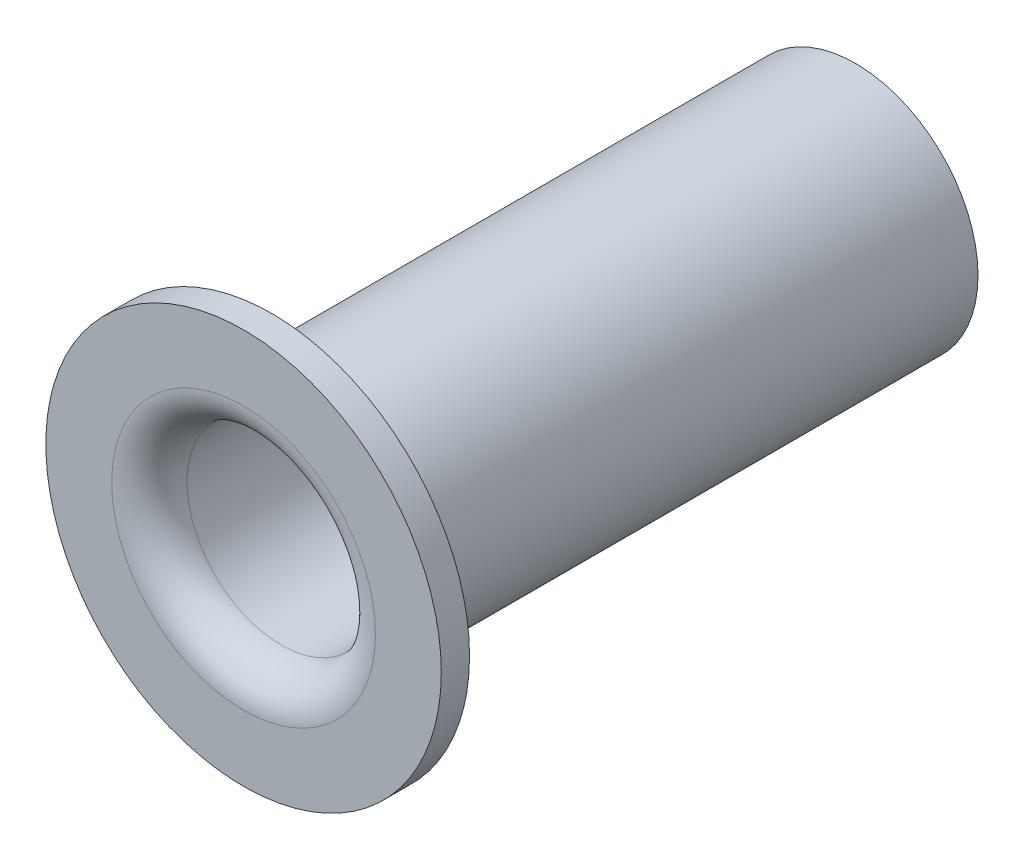
ISO-10303-21;
HEADER;
FILE_DESCRIPTION(('STEP AP214'),'2;1');
FILE_NAME('part.step','',(''),(''),'','','');
FILE_SCHEMA(('AUTOMOTIVE_DESIGN { 1 0 10303 214 1 1 1 1 }'));
ENDSEC;
DATA;
#1=APPLICATION_CONTEXT('core data for automotive mechanical design processes');
#2=APPLICATION_PROTOCOL_DEFINITION('international standard','automotive_design',2000,#1);
#3=PRODUCT_CONTEXT('',#1,'mechanical');
#4=PRODUCT('Part','Part','',(#3));
#5=PRODUCT_RELATED_PRODUCT_CATEGORY('part','',(#4));
#6=PRODUCT_DEFINITION_FORMATION('','',#4);
#7=PRODUCT_DEFINITION_CONTEXT('part definition',#1,'design');
#8=PRODUCT_DEFINITION('design','',#6,#7);
#9=PRODUCT_DEFINITION_SHAPE('','',#8);
#10=(LENGTH_UNIT() NAMED_UNIT(*) SI_UNIT(.MILLI.,.METRE.));
#11=(NAMED_UNIT(*) PLANE_ANGLE_UNIT() SI_UNIT($,.RADIAN.));
#12=(NAMED_UNIT(*) SI_UNIT($,.STERADIAN.) SOLID_ANGLE_UNIT());
#13=UNCERTAINTY_MEASURE_WITH_UNIT(LENGTH_MEASURE(1.E-05),#10,'distance_accuracy_value','');
#14=(GEOMETRIC_REPRESENTATION_CONTEXT(3) GLOBAL_UNCERTAINTY_ASSIGNED_CONTEXT((#13)) GLOBAL_UNIT_ASSIGNED_CONTEXT((#10,
#11,#12)) REPRESENTATION_CONTEXT('',''));
#15=CARTESIAN_POINT('',(0.,0.,0.));
#16=DIRECTION('',(0.,0.,1.));
#17=DIRECTION('',(1.,0.,0.));
#18=AXIS2_PLACEMENT_3D('',#15,#16,#17);
#19=CARTESIAN_POINT('',(0.,0.,0.299999999999999));
#20=DIRECTION('',(0.,0.,1.));
#21=DIRECTION('',(1.,0.,0.));
#22=AXIS2_PLACEMENT_3D('',#19,#20,#21);
#23=CYLINDRICAL_SURFACE('',#22,1.);
#24=CARTESIAN_POINT('',(0.,0.,-6.2));
#25=DIRECTION('',(0.,0.,1.));
#26=DIRECTION('',(1.,0.,0.));
#27=AXIS2_PLACEMENT_3D('',#24,#25,#26);
#28=CIRCLE('',#27,1.);
#29=CARTESIAN_POINT('',(1.,0.,-6.2));
#30=VERTEX_POINT('',#29);
#31=EDGE_CURVE('E63',#30,#30,#28,.T.);
#32=ORIENTED_EDGE('',*,*,#31,.F.);
#33=EDGE_LOOP('',(#32));
#34=FACE_BOUND('',#33,.T.);
#35=CARTESIAN_POINT('',(0.,0.,-0.100000000000001));
#36=DIRECTION('',(0.,0.,1.));
#37=DIRECTION('',(1.,0.,0.));
#38=AXIS2_PLACEMENT_3D('',#35,#36,#37);
#39=CIRCLE('',#38,1.);
#40=CARTESIAN_POINT('',(1.,0.,-0.100000000000001));
#41=VERTEX_POINT('',#40);
#42=EDGE_CURVE('E10',#41,#41,#39,.T.);
#43=ORIENTED_EDGE('',*,*,#42,.T.);
#44=EDGE_LOOP('',(#43));
#45=FACE_BOUND('',#44,.T.);
#46=ADVANCED_FACE('F35',(#34,#45),#23,.F.);
#47=CARTESIAN_POINT('',(0.,0.,-0.100000000000001));
#48=DIRECTION('',(0.,0.,1.));
#49=DIRECTION('',(1.,0.,0.));
#50=AXIS2_PLACEMENT_3D('',#47,#48,#49);
#51=TOROIDAL_SURFACE('',#50,1.4,0.4);
#52=ORIENTED_EDGE('',*,*,#42,.F.);
#53=EDGE_LOOP('',(#52));
#54=FACE_BOUND('',#53,.T.);
#55=CARTESIAN_POINT('',(0.,0.,0.299999999999999));
#56=DIRECTION('',(0.,0.,1.));
#57=DIRECTION('',(1.,0.,0.));
#58=AXIS2_PLACEMENT_3D('',#55,#56,#57);
#59=CIRCLE('',#58,1.4);
#60=CARTESIAN_POINT('',(1.4,0.,0.299999999999999));
#61=VERTEX_POINT('',#60);
#62=EDGE_CURVE('E41',#61,#61,#59,.T.);
#63=ORIENTED_EDGE('',*,*,#62,.T.);
#64=EDGE_LOOP('',(#63));
#65=FACE_BOUND('',#64,.T.);
#66=ADVANCED_FACE('F70',(#54,#65),#51,.T.);
#67=CARTESIAN_POINT('',(0.,2.1,0.299999999999999));
#68=DIRECTION('',(0.,0.,-1.));
#69=DIRECTION('',(-1.,0.,0.));
#70=AXIS2_PLACEMENT_3D('',#67,#68,#69);
#71=PLANE('',#70);
#72=ORIENTED_EDGE('',*,*,#62,.F.);
#73=EDGE_LOOP('',(#72));
#74=FACE_BOUND('',#73,.T.);
#75=CARTESIAN_POINT('',(0.,0.,0.3));
#76=DIRECTION('',(0.,0.,1.));
#77=DIRECTION('',(1.,0.,0.));
#78=AXIS2_PLACEMENT_3D('',#75,#76,#77);
#79=CIRCLE('',#78,2.1);
#80=CARTESIAN_POINT('',(2.1,0.,0.3));
#81=VERTEX_POINT('',#80);
#82=EDGE_CURVE('E45',#81,#81,#79,.T.);
#83=ORIENTED_EDGE('',*,*,#82,.T.);
#84=EDGE_LOOP('',(#83));
#85=FACE_BOUND('',#84,.T.);
#86=ADVANCED_FACE('F74',(#74,#85),#71,.F.);
#87=CARTESIAN_POINT('',(0.,0.,0.299999999999999));
#88=DIRECTION('',(0.,0.,1.));
#89=DIRECTION('',(1.,0.,0.));
#90=AXIS2_PLACEMENT_3D('',#87,#88,#89);
#91=CYLINDRICAL_SURFACE('',#90,2.1);
#92=ORIENTED_EDGE('',*,*,#82,.F.);
#93=EDGE_LOOP('',(#92));
#94=FACE_BOUND('',#93,.T.);
#95=CARTESIAN_POINT('',(0.,0.,0.));
#96=DIRECTION('',(0.,0.,1.));
#97=DIRECTION('',(1.,0.,0.));
#98=AXIS2_PLACEMENT_3D('',#95,#96,#97);
#99=CIRCLE('',#98,2.1);
#100=CARTESIAN_POINT('',(2.1,0.,0.));
#101=VERTEX_POINT('',#100);
#102=EDGE_CURVE('E49',#101,#101,#99,.T.);
#103=ORIENTED_EDGE('',*,*,#102,.T.);
#104=EDGE_LOOP('',(#103));
#105=FACE_BOUND('',#104,.T.);
#106=ADVANCED_FACE('F79',(#94,#105),#91,.T.);
#107=CARTESIAN_POINT('',(0.,1.4,0.));
#108=DIRECTION('',(0.,0.,1.));
#109=DIRECTION('',(1.,0.,0.));
#110=AXIS2_PLACEMENT_3D('',#107,#108,#109);
#111=PLANE('',#110);
#112=ORIENTED_EDGE('',*,*,#102,.F.);
#113=EDGE_LOOP('',(#112));
#114=FACE_BOUND('',#113,.T.);
#115=CARTESIAN_POINT('',(0.,0.,0.));
#116=DIRECTION('',(0.,0.,1.));
#117=DIRECTION('',(1.,0.,0.));
#118=AXIS2_PLACEMENT_3D('',#115,#116,#117);
#119=CIRCLE('',#118,1.4);
#120=CARTESIAN_POINT('',(1.4,0.,0.));
#121=VERTEX_POINT('',#120);
#122=EDGE_CURVE('E54',#121,#121,#119,.T.);
#123=ORIENTED_EDGE('',*,*,#122,.T.);
#124=EDGE_LOOP('',(#123));
#125=FACE_BOUND('',#124,.T.);
#126=ADVANCED_FACE('F85',(#114,#125),#111,.F.);
#127=CARTESIAN_POINT('',(0.,0.,-0.100000000000001));
#128=DIRECTION('',(0.,0.,1.));
#129=DIRECTION('',(1.,0.,0.));
#130=AXIS2_PLACEMENT_3D('',#127,#128,#129);
#131=TOROIDAL_SURFACE('',#130,1.4,0.100000000000001);
#132=ORIENTED_EDGE('',*,*,#122,.F.);
#133=EDGE_LOOP('',(#132));
#134=FACE_BOUND('',#133,.T.);
#135=CARTESIAN_POINT('',(0.,0.,-0.100000000000001));
#136=DIRECTION('',(0.,0.,1.));
#137=DIRECTION('',(1.,0.,0.));
#138=AXIS2_PLACEMENT_3D('',#135,#136,#137);
#139=CIRCLE('',#138,1.3);
#140=CARTESIAN_POINT('',(1.3,0.,-0.100000000000001));
#141=VERTEX_POINT('',#140);
#142=EDGE_CURVE('E57',#141,#141,#139,.T.);
#143=ORIENTED_EDGE('',*,*,#142,.T.);
#144=EDGE_LOOP('',(#143));
#145=FACE_BOUND('',#144,.T.);
#146=ADVANCED_FACE('F89',(#134,#145),#131,.F.);
#147=CARTESIAN_POINT('',(0.,0.,0.299999999999999));
#148=DIRECTION('',(0.,0.,1.));
#149=DIRECTION('',(1.,0.,0.));
#150=AXIS2_PLACEMENT_3D('',#147,#148,#149);
#151=CYLINDRICAL_SURFACE('',#150,1.3);
#152=ORIENTED_EDGE('',*,*,#142,.F.);
#153=EDGE_LOOP('',(#152));
#154=FACE_BOUND('',#153,.T.);
#155=CARTESIAN_POINT('',(0.,0.,-6.2));
#156=DIRECTION('',(0.,0.,1.));
#157=DIRECTION('',(1.,0.,0.));
#158=AXIS2_PLACEMENT_3D('',#155,#156,#157);
#159=CIRCLE('',#158,1.3);
#160=CARTESIAN_POINT('',(1.3,0.,-6.2));
#161=VERTEX_POINT('',#160);
#162=EDGE_CURVE('E60',#161,#161,#159,.T.);
#163=ORIENTED_EDGE('',*,*,#162,.T.);
#164=EDGE_LOOP('',(#163));
#165=FACE_BOUND('',#164,.T.);
#166=ADVANCED_FACE('F93',(#154,#165),#151,.T.);
#167=CARTESIAN_POINT('',(0.,1.,-6.2));
#168=DIRECTION('',(0.,0.,1.));
#169=DIRECTION('',(1.,0.,0.));
#170=AXIS2_PLACEMENT_3D('',#167,#168,#169);
#171=PLANE('',#170);
#172=ORIENTED_EDGE('',*,*,#162,.F.);
#173=EDGE_LOOP('',(#172));
#174=FACE_BOUND('',#173,.T.);
#175=ORIENTED_EDGE('',*,*,#31,.T.);
#176=EDGE_LOOP('',(#175));
#177=FACE_BOUND('',#176,.T.);
#178=ADVANCED_FACE('F67',(#174,#177),#171,.F.);
#179=CLOSED_SHELL('',(#46,#66,#86,#106,#126,#146,#166,#178));
#180=MANIFOLD_SOLID_BREP('B2',#179);
#181=ADVANCED_BREP_SHAPE_REPRESENTATION('',(#18,#180),#14);
#182=SHAPE_DEFINITION_REPRESENTATION(#9,#181);
ENDSEC;
END-ISO-10303-21;
